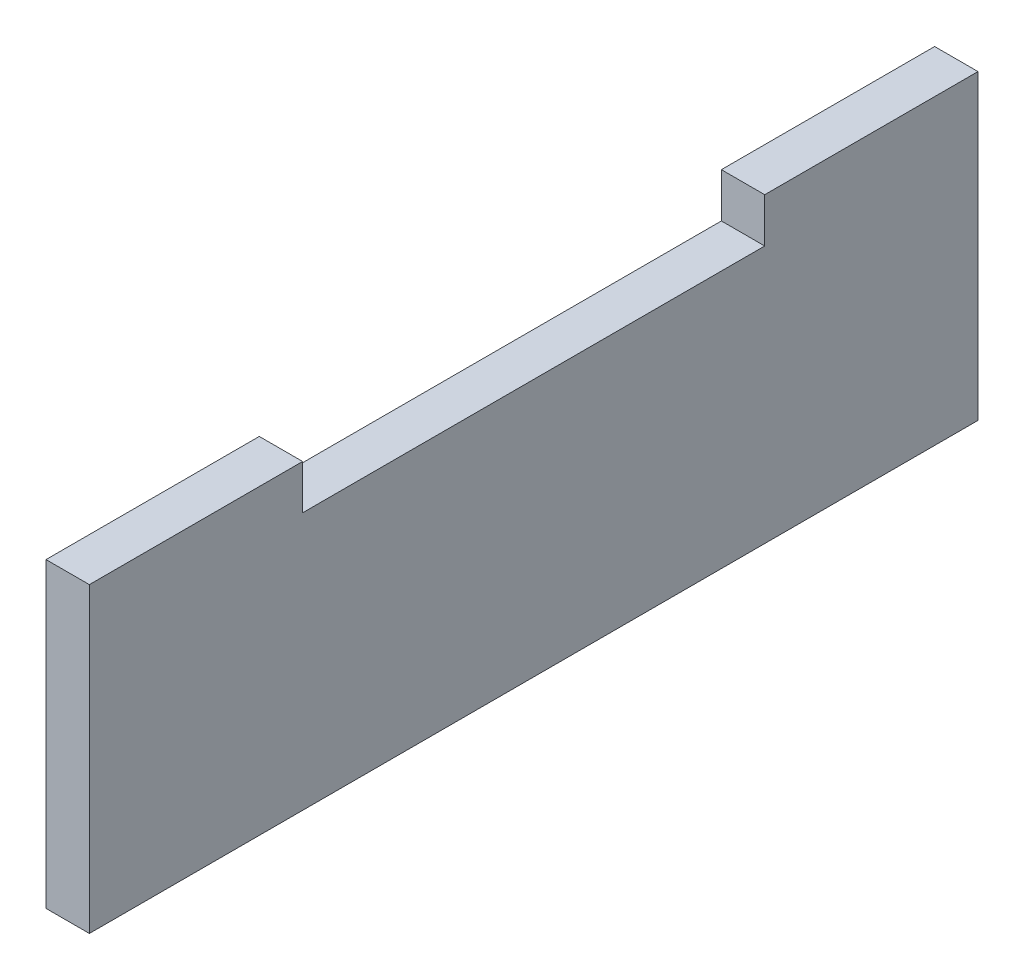
ISO-10303-21;
HEADER;
FILE_DESCRIPTION(('STEP AP214'),'2;1');
FILE_NAME('part.step','',(''),(''),'','','');
FILE_SCHEMA(('AUTOMOTIVE_DESIGN { 1 0 10303 214 1 1 1 1 }'));
ENDSEC;
DATA;
#1=APPLICATION_CONTEXT('core data for automotive mechanical design processes');
#2=APPLICATION_PROTOCOL_DEFINITION('international standard','automotive_design',2000,#1);
#3=PRODUCT_CONTEXT('',#1,'mechanical');
#4=PRODUCT('Part','Part','',(#3));
#5=PRODUCT_RELATED_PRODUCT_CATEGORY('part','',(#4));
#6=PRODUCT_DEFINITION_FORMATION('','',#4);
#7=PRODUCT_DEFINITION_CONTEXT('part definition',#1,'design');
#8=PRODUCT_DEFINITION('design','',#6,#7);
#9=PRODUCT_DEFINITION_SHAPE('','',#8);
#10=(LENGTH_UNIT() NAMED_UNIT(*) SI_UNIT(.MILLI.,.METRE.));
#11=(NAMED_UNIT(*) PLANE_ANGLE_UNIT() SI_UNIT($,.RADIAN.));
#12=(NAMED_UNIT(*) SI_UNIT($,.STERADIAN.) SOLID_ANGLE_UNIT());
#13=UNCERTAINTY_MEASURE_WITH_UNIT(LENGTH_MEASURE(1.E-05),#10,'distance_accuracy_value','');
#14=(GEOMETRIC_REPRESENTATION_CONTEXT(3) GLOBAL_UNCERTAINTY_ASSIGNED_CONTEXT((#13)) GLOBAL_UNIT_ASSIGNED_CONTEXT((#10,
#11,#12)) REPRESENTATION_CONTEXT('',''));
#15=CARTESIAN_POINT('',(0.,0.,0.));
#16=DIRECTION('',(0.,0.,1.));
#17=DIRECTION('',(1.,0.,0.));
#18=AXIS2_PLACEMENT_3D('',#15,#16,#17);
#19=CARTESIAN_POINT('',(12.2,42.5,0.));
#20=DIRECTION('',(0.,1.,0.));
#21=DIRECTION('',(0.,0.,1.));
#22=AXIS2_PLACEMENT_3D('',#19,#20,#21);
#23=PLANE('',#22);
#24=DIRECTION('',(0.,0.,-1.));
#25=VECTOR('',#24,1.);
#26=CARTESIAN_POINT('',(0.,42.5,0.));
#27=LINE('',#26,#25);
#28=CARTESIAN_POINT('',(0.,42.5,-65.));
#29=VERTEX_POINT('',#28);
#30=CARTESIAN_POINT('',(0.,42.5,-125.));
#31=VERTEX_POINT('',#30);
#32=EDGE_CURVE('E132',#29,#31,#27,.T.);
#33=ORIENTED_EDGE('',*,*,#32,.F.);
#34=DIRECTION('',(-1.,0.,0.));
#35=VECTOR('',#34,1.);
#36=CARTESIAN_POINT('',(12.2,42.5,-65.));
#37=LINE('',#36,#35);
#38=CARTESIAN_POINT('',(12.2,42.5,-65.));
#39=VERTEX_POINT('',#38);
#40=EDGE_CURVE('E11',#39,#29,#37,.T.);
#41=ORIENTED_EDGE('',*,*,#40,.F.);
#42=DIRECTION('',(0.,0.,-1.));
#43=VECTOR('',#42,1.);
#44=CARTESIAN_POINT('',(12.2,42.5,0.));
#45=LINE('',#44,#43);
#46=CARTESIAN_POINT('',(12.2,42.5,-125.));
#47=VERTEX_POINT('',#46);
#48=EDGE_CURVE('E150',#39,#47,#45,.T.);
#49=ORIENTED_EDGE('',*,*,#48,.T.);
#50=DIRECTION('',(-1.,0.,0.));
#51=VECTOR('',#50,1.);
#52=CARTESIAN_POINT('',(12.2,42.5,-125.));
#53=LINE('',#52,#51);
#54=EDGE_CURVE('E54',#47,#31,#53,.T.);
#55=ORIENTED_EDGE('',*,*,#54,.T.);
#56=EDGE_LOOP('',(#33,#41,#49,#55));
#57=FACE_BOUND('',#56,.T.);
#58=ADVANCED_FACE('F37',(#57),#23,.T.);
#59=CARTESIAN_POINT('',(12.2,0.,-65.));
#60=DIRECTION('',(0.,0.,-1.));
#61=DIRECTION('',(-1.,0.,0.));
#62=AXIS2_PLACEMENT_3D('',#59,#60,#61);
#63=PLANE('',#62);
#64=DIRECTION('',(0.,-1.,0.));
#65=VECTOR('',#64,1.);
#66=CARTESIAN_POINT('',(0.,0.,-65.));
#67=LINE('',#66,#65);
#68=CARTESIAN_POINT('',(0.,30.,-65.));
#69=VERTEX_POINT('',#68);
#70=EDGE_CURVE('E134',#29,#69,#67,.T.);
#71=ORIENTED_EDGE('',*,*,#70,.T.);
#72=DIRECTION('',(-1.,0.,0.));
#73=VECTOR('',#72,1.);
#74=CARTESIAN_POINT('',(12.2,30.,-65.));
#75=LINE('',#74,#73);
#76=CARTESIAN_POINT('',(12.2,30.,-65.));
#77=VERTEX_POINT('',#76);
#78=EDGE_CURVE('E46',#77,#69,#75,.T.);
#79=ORIENTED_EDGE('',*,*,#78,.F.);
#80=DIRECTION('',(0.,-1.,0.));
#81=VECTOR('',#80,1.);
#82=CARTESIAN_POINT('',(12.2,0.,-65.));
#83=LINE('',#82,#81);
#84=EDGE_CURVE('E175',#39,#77,#83,.T.);
#85=ORIENTED_EDGE('',*,*,#84,.F.);
#86=ORIENTED_EDGE('',*,*,#40,.T.);
#87=EDGE_LOOP('',(#71,#79,#85,#86));
#88=FACE_BOUND('',#87,.T.);
#89=ADVANCED_FACE('F39',(#88),#63,.F.);
#90=CARTESIAN_POINT('',(12.2,30.,0.));
#91=DIRECTION('',(0.,1.,0.));
#92=DIRECTION('',(0.,0.,1.));
#93=AXIS2_PLACEMENT_3D('',#90,#91,#92);
#94=PLANE('',#93);
#95=DIRECTION('',(0.,0.,-1.));
#96=VECTOR('',#95,1.);
#97=CARTESIAN_POINT('',(0.,30.,0.));
#98=LINE('',#97,#96);
#99=CARTESIAN_POINT('',(0.,30.,65.));
#100=VERTEX_POINT('',#99);
#101=EDGE_CURVE('E138',#100,#69,#98,.T.);
#102=ORIENTED_EDGE('',*,*,#101,.F.);
#103=DIRECTION('',(-1.,0.,0.));
#104=VECTOR('',#103,1.);
#105=CARTESIAN_POINT('',(12.2,30.,65.));
#106=LINE('',#105,#104);
#107=CARTESIAN_POINT('',(12.2,30.,65.));
#108=VERTEX_POINT('',#107);
#109=EDGE_CURVE('E156',#108,#100,#106,.T.);
#110=ORIENTED_EDGE('',*,*,#109,.F.);
#111=DIRECTION('',(0.,0.,-1.));
#112=VECTOR('',#111,1.);
#113=CARTESIAN_POINT('',(12.2,30.,0.));
#114=LINE('',#113,#112);
#115=EDGE_CURVE('E163',#108,#77,#114,.T.);
#116=ORIENTED_EDGE('',*,*,#115,.T.);
#117=ORIENTED_EDGE('',*,*,#78,.T.);
#118=EDGE_LOOP('',(#102,#110,#116,#117));
#119=FACE_BOUND('',#118,.T.);
#120=ADVANCED_FACE('F161',(#119),#94,.T.);
#121=CARTESIAN_POINT('',(12.2,0.,65.));
#122=DIRECTION('',(0.,0.,-1.));
#123=DIRECTION('',(-1.,0.,0.));
#124=AXIS2_PLACEMENT_3D('',#121,#122,#123);
#125=PLANE('',#124);
#126=DIRECTION('',(0.,-1.,0.));
#127=VECTOR('',#126,1.);
#128=CARTESIAN_POINT('',(0.,0.,65.));
#129=LINE('',#128,#127);
#130=CARTESIAN_POINT('',(0.,42.5,65.));
#131=VERTEX_POINT('',#130);
#132=EDGE_CURVE('E141',#131,#100,#129,.T.);
#133=ORIENTED_EDGE('',*,*,#132,.F.);
#134=DIRECTION('',(-1.,0.,0.));
#135=VECTOR('',#134,1.);
#136=CARTESIAN_POINT('',(12.2,42.5,65.));
#137=LINE('',#136,#135);
#138=CARTESIAN_POINT('',(12.2,42.5,65.));
#139=VERTEX_POINT('',#138);
#140=EDGE_CURVE('E154',#139,#131,#137,.T.);
#141=ORIENTED_EDGE('',*,*,#140,.F.);
#142=DIRECTION('',(0.,-1.,0.));
#143=VECTOR('',#142,1.);
#144=CARTESIAN_POINT('',(12.2,0.,65.));
#145=LINE('',#144,#143);
#146=EDGE_CURVE('E174',#139,#108,#145,.T.);
#147=ORIENTED_EDGE('',*,*,#146,.T.);
#148=ORIENTED_EDGE('',*,*,#109,.T.);
#149=EDGE_LOOP('',(#133,#141,#147,#148));
#150=FACE_BOUND('',#149,.T.);
#151=ADVANCED_FACE('F172',(#150),#125,.T.);
#152=CARTESIAN_POINT('',(0.,42.5,125.));
#153=VERTEX_POINT('',#152);
#154=EDGE_CURVE('E135',#153,#131,#27,.T.);
#155=ORIENTED_EDGE('',*,*,#154,.F.);
#156=DIRECTION('',(-1.,0.,0.));
#157=VECTOR('',#156,1.);
#158=CARTESIAN_POINT('',(12.2,42.5,125.));
#159=LINE('',#158,#157);
#160=CARTESIAN_POINT('',(12.2,42.5,125.));
#161=VERTEX_POINT('',#160);
#162=EDGE_CURVE('E124',#161,#153,#159,.T.);
#163=ORIENTED_EDGE('',*,*,#162,.F.);
#164=EDGE_CURVE('E114',#161,#139,#45,.T.);
#165=ORIENTED_EDGE('',*,*,#164,.T.);
#166=ORIENTED_EDGE('',*,*,#140,.T.);
#167=EDGE_LOOP('',(#155,#163,#165,#166));
#168=FACE_BOUND('',#167,.T.);
#169=ADVANCED_FACE('F180',(#168),#23,.T.);
#170=CARTESIAN_POINT('',(12.2,0.,125.));
#171=DIRECTION('',(0.,0.,-1.));
#172=DIRECTION('',(0.,1.,0.));
#173=AXIS2_PLACEMENT_3D('',#170,#171,#172);
#174=PLANE('',#173);
#175=DIRECTION('',(0.,-1.,0.));
#176=VECTOR('',#175,1.);
#177=CARTESIAN_POINT('',(0.,0.,125.));
#178=LINE('',#177,#176);
#179=CARTESIAN_POINT('',(0.,-42.5,125.));
#180=VERTEX_POINT('',#179);
#181=EDGE_CURVE('E121',#153,#180,#178,.T.);
#182=ORIENTED_EDGE('',*,*,#181,.T.);
#183=DIRECTION('',(-1.,0.,0.));
#184=VECTOR('',#183,1.);
#185=CARTESIAN_POINT('',(12.2,-42.5,125.));
#186=LINE('',#185,#184);
#187=CARTESIAN_POINT('',(12.2,-42.5,125.));
#188=VERTEX_POINT('',#187);
#189=EDGE_CURVE('E118',#188,#180,#186,.T.);
#190=ORIENTED_EDGE('',*,*,#189,.F.);
#191=DIRECTION('',(0.,-1.,0.));
#192=VECTOR('',#191,1.);
#193=CARTESIAN_POINT('',(12.2,0.,125.));
#194=LINE('',#193,#192);
#195=EDGE_CURVE('E105',#161,#188,#194,.T.);
#196=ORIENTED_EDGE('',*,*,#195,.F.);
#197=ORIENTED_EDGE('',*,*,#162,.T.);
#198=EDGE_LOOP('',(#182,#190,#196,#197));
#199=FACE_BOUND('',#198,.T.);
#200=ADVANCED_FACE('F119',(#199),#174,.F.);
#201=CARTESIAN_POINT('',(12.2,-42.5,0.));
#202=DIRECTION('',(0.,1.,0.));
#203=DIRECTION('',(0.,0.,1.));
#204=AXIS2_PLACEMENT_3D('',#201,#202,#203);
#205=PLANE('',#204);
#206=DIRECTION('',(0.,0.,-1.));
#207=VECTOR('',#206,1.);
#208=CARTESIAN_POINT('',(0.,-42.5,0.));
#209=LINE('',#208,#207);
#210=CARTESIAN_POINT('',(0.,-42.5,-125.));
#211=VERTEX_POINT('',#210);
#212=EDGE_CURVE('E145',#180,#211,#209,.T.);
#213=ORIENTED_EDGE('',*,*,#212,.T.);
#214=DIRECTION('',(-1.,0.,0.));
#215=VECTOR('',#214,1.);
#216=CARTESIAN_POINT('',(12.2,-42.5,-125.));
#217=LINE('',#216,#215);
#218=CARTESIAN_POINT('',(12.2,-42.5,-125.));
#219=VERTEX_POINT('',#218);
#220=EDGE_CURVE('E80',#219,#211,#217,.T.);
#221=ORIENTED_EDGE('',*,*,#220,.F.);
#222=DIRECTION('',(0.,0.,-1.));
#223=VECTOR('',#222,1.);
#224=CARTESIAN_POINT('',(12.2,-42.5,0.));
#225=LINE('',#224,#223);
#226=EDGE_CURVE('E111',#188,#219,#225,.T.);
#227=ORIENTED_EDGE('',*,*,#226,.F.);
#228=ORIENTED_EDGE('',*,*,#189,.T.);
#229=EDGE_LOOP('',(#213,#221,#227,#228));
#230=FACE_BOUND('',#229,.T.);
#231=ADVANCED_FACE('F126',(#230),#205,.F.);
#232=CARTESIAN_POINT('',(12.2,0.,-125.));
#233=DIRECTION('',(0.,0.,-1.));
#234=DIRECTION('',(0.,1.,0.));
#235=AXIS2_PLACEMENT_3D('',#232,#233,#234);
#236=PLANE('',#235);
#237=DIRECTION('',(0.,-1.,0.));
#238=VECTOR('',#237,1.);
#239=CARTESIAN_POINT('',(0.,0.,-125.));
#240=LINE('',#239,#238);
#241=EDGE_CURVE('E147',#31,#211,#240,.T.);
#242=ORIENTED_EDGE('',*,*,#241,.F.);
#243=ORIENTED_EDGE('',*,*,#54,.F.);
#244=DIRECTION('',(0.,-1.,0.));
#245=VECTOR('',#244,1.);
#246=CARTESIAN_POINT('',(12.2,0.,-125.));
#247=LINE('',#246,#245);
#248=EDGE_CURVE('E127',#47,#219,#247,.T.);
#249=ORIENTED_EDGE('',*,*,#248,.T.);
#250=ORIENTED_EDGE('',*,*,#220,.T.);
#251=EDGE_LOOP('',(#242,#243,#249,#250));
#252=FACE_BOUND('',#251,.T.);
#253=ADVANCED_FACE('F181',(#252),#236,.T.);
#254=CARTESIAN_POINT('',(12.2,0.,0.));
#255=DIRECTION('',(1.,0.,0.));
#256=DIRECTION('',(0.,0.,-1.));
#257=AXIS2_PLACEMENT_3D('',#254,#255,#256);
#258=PLANE('',#257);
#259=ORIENTED_EDGE('',*,*,#48,.F.);
#260=ORIENTED_EDGE('',*,*,#84,.T.);
#261=ORIENTED_EDGE('',*,*,#115,.F.);
#262=ORIENTED_EDGE('',*,*,#146,.F.);
#263=ORIENTED_EDGE('',*,*,#164,.F.);
#264=ORIENTED_EDGE('',*,*,#195,.T.);
#265=ORIENTED_EDGE('',*,*,#226,.T.);
#266=ORIENTED_EDGE('',*,*,#248,.F.);
#267=EDGE_LOOP('',(#259,#260,#261,#262,#263,#264,#265,#266));
#268=FACE_BOUND('',#267,.T.);
#269=ADVANCED_FACE('F108',(#268),#258,.T.);
#270=CARTESIAN_POINT('',(0.,0.,0.));
#271=DIRECTION('',(1.,0.,0.));
#272=DIRECTION('',(0.,0.,-1.));
#273=AXIS2_PLACEMENT_3D('',#270,#271,#272);
#274=PLANE('',#273);
#275=ORIENTED_EDGE('',*,*,#32,.T.);
#276=ORIENTED_EDGE('',*,*,#241,.T.);
#277=ORIENTED_EDGE('',*,*,#212,.F.);
#278=ORIENTED_EDGE('',*,*,#181,.F.);
#279=ORIENTED_EDGE('',*,*,#154,.T.);
#280=ORIENTED_EDGE('',*,*,#132,.T.);
#281=ORIENTED_EDGE('',*,*,#101,.T.);
#282=ORIENTED_EDGE('',*,*,#70,.F.);
#283=EDGE_LOOP('',(#275,#276,#277,#278,#279,#280,#281,#282));
#284=FACE_BOUND('',#283,.T.);
#285=ADVANCED_FACE('F167',(#284),#274,.F.);
#286=CLOSED_SHELL('',(#58,#89,#120,#151,#169,#200,#231,#253,#269,#285));
#287=MANIFOLD_SOLID_BREP('B2',#286);
#288=ADVANCED_BREP_SHAPE_REPRESENTATION('',(#18,#287),#14);
#289=SHAPE_DEFINITION_REPRESENTATION(#9,#288);
ENDSEC;
END-ISO-10303-21;
